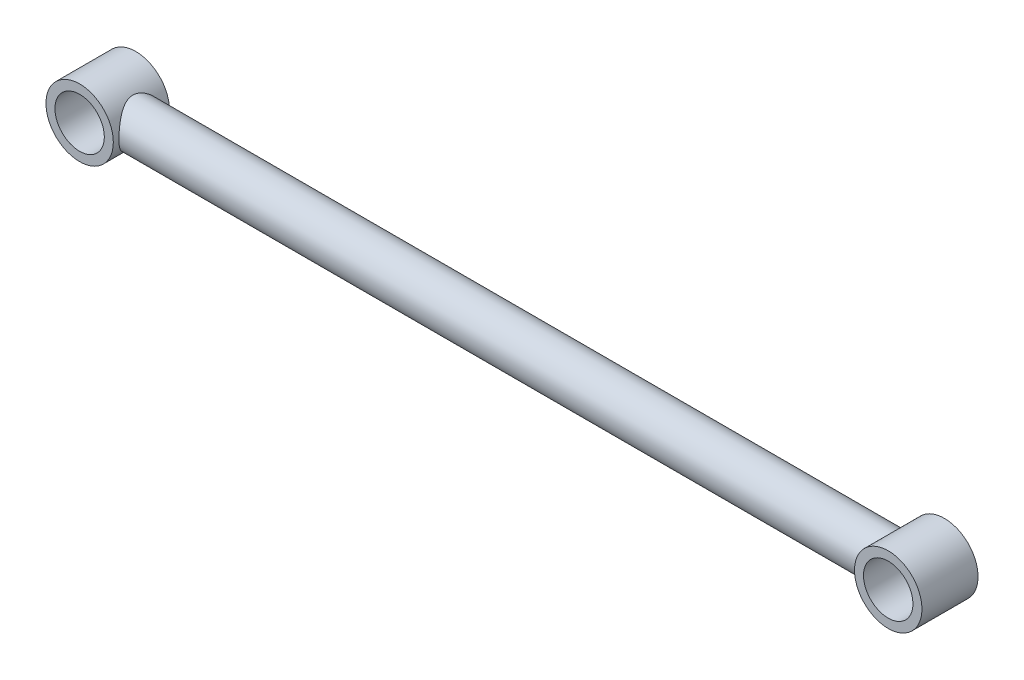
ISO-10303-21;
HEADER;
FILE_DESCRIPTION(('STEP AP214'),'2;1');
FILE_NAME('part.step','',(''),(''),'','','');
FILE_SCHEMA(('AUTOMOTIVE_DESIGN { 1 0 10303 214 1 1 1 1 }'));
ENDSEC;
DATA;
#1=APPLICATION_CONTEXT('core data for automotive mechanical design processes');
#2=APPLICATION_PROTOCOL_DEFINITION('international standard','automotive_design',2000,#1);
#3=PRODUCT_CONTEXT('',#1,'mechanical');
#4=PRODUCT('Part','Part','',(#3));
#5=PRODUCT_RELATED_PRODUCT_CATEGORY('part','',(#4));
#6=PRODUCT_DEFINITION_FORMATION('','',#4);
#7=PRODUCT_DEFINITION_CONTEXT('part definition',#1,'design');
#8=PRODUCT_DEFINITION('design','',#6,#7);
#9=PRODUCT_DEFINITION_SHAPE('','',#8);
#10=(LENGTH_UNIT() NAMED_UNIT(*) SI_UNIT(.MILLI.,.METRE.));
#11=(NAMED_UNIT(*) PLANE_ANGLE_UNIT() SI_UNIT($,.RADIAN.));
#12=(NAMED_UNIT(*) SI_UNIT($,.STERADIAN.) SOLID_ANGLE_UNIT());
#13=UNCERTAINTY_MEASURE_WITH_UNIT(LENGTH_MEASURE(1.E-05),#10,'distance_accuracy_value','');
#14=(GEOMETRIC_REPRESENTATION_CONTEXT(3) GLOBAL_UNCERTAINTY_ASSIGNED_CONTEXT((#13)) GLOBAL_UNIT_ASSIGNED_CONTEXT((#10,
#11,#12)) REPRESENTATION_CONTEXT('',''));
#15=CARTESIAN_POINT('',(0.,0.,0.));
#16=DIRECTION('',(0.,0.,1.));
#17=DIRECTION('',(1.,0.,0.));
#18=AXIS2_PLACEMENT_3D('',#15,#16,#17);
#19=CARTESIAN_POINT('',(-114.3,0.,7.9375));
#20=DIRECTION('',(0.,0.,1.));
#21=DIRECTION('',(1.,0.,0.));
#22=AXIS2_PLACEMENT_3D('',#19,#20,#21);
#23=PLANE('',#22);
#24=CARTESIAN_POINT('',(-114.3,0.,7.9375));
#25=DIRECTION('',(0.,0.,1.));
#26=DIRECTION('',(1.,0.,0.));
#27=AXIS2_PLACEMENT_3D('',#24,#25,#26);
#28=CIRCLE('',#27,9.52500000000001);
#29=CARTESIAN_POINT('',(-104.775,0.,7.9375));
#30=VERTEX_POINT('',#29);
#31=EDGE_CURVE('E10',#30,#30,#28,.T.);
#32=ORIENTED_EDGE('',*,*,#31,.T.);
#33=EDGE_LOOP('',(#32));
#34=FACE_BOUND('',#33,.T.);
#35=CARTESIAN_POINT('',(-114.3,0.,7.9375));
#36=DIRECTION('',(0.,0.,1.));
#37=DIRECTION('',(1.,0.,0.));
#38=AXIS2_PLACEMENT_3D('',#35,#36,#37);
#39=CIRCLE('',#38,6.985);
#40=CARTESIAN_POINT('',(-107.315,0.,7.9375));
#41=VERTEX_POINT('',#40);
#42=EDGE_CURVE('E50',#41,#41,#39,.T.);
#43=ORIENTED_EDGE('',*,*,#42,.F.);
#44=EDGE_LOOP('',(#43));
#45=FACE_BOUND('',#44,.T.);
#46=ADVANCED_FACE('F38',(#34,#45),#23,.T.);
#47=CARTESIAN_POINT('',(-114.3,0.,-7.9375));
#48=DIRECTION('',(0.,0.,1.));
#49=DIRECTION('',(1.,0.,0.));
#50=AXIS2_PLACEMENT_3D('',#47,#48,#49);
#51=PLANE('',#50);
#52=CARTESIAN_POINT('',(-114.3,0.,-7.9375));
#53=DIRECTION('',(0.,0.,1.));
#54=DIRECTION('',(1.,0.,0.));
#55=AXIS2_PLACEMENT_3D('',#52,#53,#54);
#56=CIRCLE('',#55,9.52500000000001);
#57=CARTESIAN_POINT('',(-104.775,0.,-7.9375));
#58=VERTEX_POINT('',#57);
#59=EDGE_CURVE('E37',#58,#58,#56,.T.);
#60=ORIENTED_EDGE('',*,*,#59,.F.);
#61=EDGE_LOOP('',(#60));
#62=FACE_BOUND('',#61,.T.);
#63=CARTESIAN_POINT('',(-114.3,0.,-7.9375));
#64=DIRECTION('',(0.,0.,1.));
#65=DIRECTION('',(1.,0.,0.));
#66=AXIS2_PLACEMENT_3D('',#63,#64,#65);
#67=CIRCLE('',#66,6.985);
#68=CARTESIAN_POINT('',(-107.315,0.,-7.9375));
#69=VERTEX_POINT('',#68);
#70=EDGE_CURVE('E47',#69,#69,#67,.T.);
#71=ORIENTED_EDGE('',*,*,#70,.T.);
#72=EDGE_LOOP('',(#71));
#73=FACE_BOUND('',#72,.T.);
#74=ADVANCED_FACE('F96',(#62,#73),#51,.F.);
#75=CARTESIAN_POINT('',(-114.3,0.,7.9375));
#76=DIRECTION('',(0.,0.,-1.));
#77=DIRECTION('',(-1.,0.,0.));
#78=AXIS2_PLACEMENT_3D('',#75,#76,#77);
#79=CYLINDRICAL_SURFACE('',#78,9.52500000000001);
#80=CARTESIAN_POINT('',(-104.775,0.,-6.35));
#81=CARTESIAN_POINT('',(-104.775000046979,0.159522184680151,-6.34999995309993));
#82=CARTESIAN_POINT('',(-104.779015986517,0.319045176051453,-6.34398077800588));
#83=CARTESIAN_POINT('',(-104.794978527502,0.636787051617951,-6.31999903690909));
#84=CARTESIAN_POINT('',(-104.80692517069,0.795005928944789,-6.30203640804456));
#85=CARTESIAN_POINT('',(-104.838460307179,1.10896054848766,-6.25443250914488));
#86=CARTESIAN_POINT('',(-104.858051779359,1.26469529808782,-6.22478668659856));
#87=CARTESIAN_POINT('',(-104.904409633166,1.57249344529696,-6.15424235588193));
#88=CARTESIAN_POINT('',(-104.93117610155,1.72455679848855,-6.11334371164659));
#89=CARTESIAN_POINT('',(-104.991134625795,2.0232991313789,-6.02105271254959));
#90=CARTESIAN_POINT('',(-105.024294057865,2.17000113120487,-5.96971356640109));
#91=CARTESIAN_POINT('',(-105.096428688631,2.45804513242559,-5.85700143837656));
#92=CARTESIAN_POINT('',(-105.135406152721,2.59938501894372,-5.79562454716315));
#93=CARTESIAN_POINT('',(-105.259913593527,3.01423554513469,-5.59738202122274));
#94=CARTESIAN_POINT('',(-105.353072441146,3.27883515147387,-5.44632353198541));
#95=CARTESIAN_POINT('',(-105.561537093138,3.80142041951417,-5.09695259312099));
#96=CARTESIAN_POINT('',(-105.67805141233,4.0569395333457,-4.8957180412682));
#97=CARTESIAN_POINT('',(-105.918578676676,4.53304949629232,-4.45853706819435));
#98=CARTESIAN_POINT('',(-106.042602212729,4.75358934716347,-4.22254091484816));
#99=CARTESIAN_POINT('',(-106.236520724273,5.07195092137751,-3.8252657100131));
#100=CARTESIAN_POINT('',(-106.307238340935,5.18236901523892,-3.6743180921881));
#101=CARTESIAN_POINT('',(-106.44576818144,5.39001471464344,-3.36235031614727));
#102=CARTESIAN_POINT('',(-106.513579743182,5.4872393250594,-3.20132788287224));
#103=CARTESIAN_POINT('',(-106.709012460451,5.7577566096913,-2.70419909809922));
#104=CARTESIAN_POINT('',(-106.82904613228,5.91054020678916,-2.35322869616773));
#105=CARTESIAN_POINT('',(-106.998261159788,6.11742154042014,-1.72484951871111));
#106=CARTESIAN_POINT('',(-107.057893093953,6.18727602427478,-1.45545976596657));
#107=CARTESIAN_POINT('',(-107.125563890268,6.26531820247608,-1.04302236510498));
#108=CARTESIAN_POINT('',(-107.144488102872,6.28687240788072,-0.904207956229357));
#109=CARTESIAN_POINT('',(-107.174415904695,6.3207759558173,-0.624583310483378));
#110=CARTESIAN_POINT('',(-107.185419450505,6.33312524790352,-0.483773062679525));
#111=CARTESIAN_POINT('',(-107.19906314611,6.34841901679302,-0.200650368697279));
#112=CARTESIAN_POINT('',(-107.201668474253,6.35132433633169,-0.0583341165071237));
#113=CARTESIAN_POINT('',(-107.198309166824,6.34756793895041,0.226068969145017));
#114=CARTESIAN_POINT('',(-107.192344502142,6.34090618953289,0.368155801826066));
#115=CARTESIAN_POINT('',(-107.172091797798,6.31813114119061,0.651046759237973));
#116=CARTESIAN_POINT('',(-107.157799247005,6.3020127196492,0.791850146722155));
#117=CARTESIAN_POINT('',(-107.12147709183,6.26060539238662,1.07111152675893));
#118=CARTESIAN_POINT('',(-107.099444230048,6.23531262562655,1.20956850610407));
#119=CARTESIAN_POINT('',(-107.025210423189,6.14887903259729,1.60786389937654));
#120=CARTESIAN_POINT('',(-106.963797982987,6.0760573598935,1.86355519237661));
#121=CARTESIAN_POINT('',(-106.822569241335,5.90137074153365,2.35914728507178));
#122=CARTESIAN_POINT('',(-106.742746885614,5.7994962389741,2.59904285676261));
#123=CARTESIAN_POINT('',(-106.554139603236,5.54590170976804,3.108382532951));
#124=CARTESIAN_POINT('',(-106.442766085441,5.38825776175065,3.37391155926158));
#125=CARTESIAN_POINT('',(-106.213531488159,5.03771235908976,3.87792594650756));
#126=CARTESIAN_POINT('',(-106.095662533807,4.84476741891087,4.11637735817127));
#127=CARTESIAN_POINT('',(-105.908104555103,4.50810755637881,4.47595327468266));
#128=CARTESIAN_POINT('',(-105.837623502565,4.37470228651639,4.60645639811851));
#129=CARTESIAN_POINT('',(-105.699343282144,4.09615348557977,4.85581618812812));
#130=CARTESIAN_POINT('',(-105.631543321566,3.95101346324308,4.97467631266899));
#131=CARTESIAN_POINT('',(-105.50037807823,3.64956085943843,5.19986397242147));
#132=CARTESIAN_POINT('',(-105.437010607565,3.4932538681889,5.30619770873185));
#133=CARTESIAN_POINT('',(-105.316348158326,3.17007087803655,5.50537494924364));
#134=CARTESIAN_POINT('',(-105.259051510077,3.0031978054296,5.59822216529964));
#135=CARTESIAN_POINT('',(-105.162613382563,2.69345636597062,5.75252854890914));
#136=CARTESIAN_POINT('',(-105.122114554482,2.55229325204632,5.81657300618918));
#137=CARTESIAN_POINT('',(-105.046866789935,2.26434990710746,5.93459496476216));
#138=CARTESIAN_POINT('',(-105.012116689131,2.11757082097555,5.9885745048681));
#139=CARTESIAN_POINT('',(-104.949108184495,1.81925046113754,6.08583803598801));
#140=CARTESIAN_POINT('',(-104.920845697984,1.66771225100849,6.12912875481975));
#141=CARTESIAN_POINT('',(-104.871415051727,1.36072699934382,6.20450638275708));
#142=CARTESIAN_POINT('',(-104.850247001113,1.20527989771778,6.23659311951361));
#143=CARTESIAN_POINT('',(-104.815431118356,0.890896472094997,6.28922202718465));
#144=CARTESIAN_POINT('',(-104.801816584345,0.731947860313394,6.30971308872808));
#145=CARTESIAN_POINT('',(-104.782589645165,0.412470575279602,6.33861907184867));
#146=CARTESIAN_POINT('',(-104.776977250453,0.251941899963072,6.34703397764633));
#147=CARTESIAN_POINT('',(-104.773897709643,-0.0693625623608653,6.35165354452134));
#148=CARTESIAN_POINT('',(-104.776430227829,-0.230138338910224,6.34785870886032));
#149=CARTESIAN_POINT('',(-104.789575352673,-0.550602615987341,6.32812028928751));
#150=CARTESIAN_POINT('',(-104.800187614471,-0.710291162626874,6.31217722388782));
#151=CARTESIAN_POINT('',(-104.828197226723,-1.01610484215325,6.26994038091227));
#152=CARTESIAN_POINT('',(-104.845062925682,-1.1623919007298,6.24445641716826));
#153=CARTESIAN_POINT('',(-104.885191426505,-1.4520294867599,6.18352816653401));
#154=CARTESIAN_POINT('',(-104.908456400489,-1.59537899933077,6.14808049754927));
#155=CARTESIAN_POINT('',(-104.960910310942,-1.87821807256356,6.06765212024478));
#156=CARTESIAN_POINT('',(-104.990097475877,-2.01770877338369,6.02267426255711));
#157=CARTESIAN_POINT('',(-105.053845477458,-2.29219225922946,5.92365375533574));
#158=CARTESIAN_POINT('',(-105.088408378516,-2.42718329198913,5.86960762273506));
#159=CARTESIAN_POINT('',(-105.203710599838,-2.84040335082915,5.68758288364751));
#160=CARTESIAN_POINT('',(-105.292837429105,-3.10985671270755,5.54455672594065));
#161=CARTESIAN_POINT('',(-105.486150284111,-3.62171230160445,5.22465767898185));
#162=CARTESIAN_POINT('',(-105.590345600392,-3.86409767513917,5.04776388653557));
#163=CARTESIAN_POINT('',(-105.824185539793,-4.35561770830212,4.63358452856244));
#164=CARTESIAN_POINT('',(-105.955249040271,-4.59975869240833,4.3911724539023));
#165=CARTESIAN_POINT('',(-106.217385749945,-5.04618201875886,3.86993085248224));
#166=CARTESIAN_POINT('',(-106.348458903714,-5.24843542955316,3.59107637060042));
#167=CARTESIAN_POINT('',(-106.529729875084,-5.50986238821868,3.1605267462145));
#168=CARTESIAN_POINT('',(-106.585258233999,-5.58717130076448,3.02182669552111));
#169=CARTESIAN_POINT('',(-106.692076778903,-5.7317702439199,2.73764917534889));
#170=CARTESIAN_POINT('',(-106.743366461208,-5.79905908459569,2.59217090361127));
#171=CARTESIAN_POINT('',(-106.840055954372,-5.92292443514784,2.29506782648151));
#172=CARTESIAN_POINT('',(-106.885463486072,-5.97951503318805,2.14345142837806));
#173=CARTESIAN_POINT('',(-106.968794514328,-6.08139674336706,1.83453891209853));
#174=CARTESIAN_POINT('',(-107.006722749788,-6.12669501519679,1.67724646551724));
#175=CARTESIAN_POINT('',(-107.06749984168,-6.19825433375949,1.38649198607604));
#176=CARTESIAN_POINT('',(-107.091833395441,-6.22647305217836,1.25382053027027));
#177=CARTESIAN_POINT('',(-107.133570804051,-6.27446673556615,0.985934910577462));
#178=CARTESIAN_POINT('',(-107.150978120094,-6.29424591831616,0.850722052153063));
#179=CARTESIAN_POINT('',(-107.178227277172,-6.32506156675046,0.578640956196189));
#180=CARTESIAN_POINT('',(-107.188074658184,-6.33610443465317,0.441774005648219));
#181=CARTESIAN_POINT('',(-107.199837931634,-6.3492836735303,0.167265028180356));
#182=CARTESIAN_POINT('',(-107.20175370832,-6.35141991452216,0.0296229899782549));
#183=CARTESIAN_POINT('',(-107.197574216774,-6.34674580421029,-0.245464103467704));
#184=CARTESIAN_POINT('',(-107.191474375349,-6.33993034564554,-0.382909001434104));
#185=CARTESIAN_POINT('',(-107.171501290415,-6.31746425650634,-0.656495580724789));
#186=CARTESIAN_POINT('',(-107.157628110631,-6.30181369836103,-0.792637272723304));
#187=CARTESIAN_POINT('',(-107.122621591036,-6.26191390883439,-1.06282725973877));
#188=CARTESIAN_POINT('',(-107.101481599347,-6.2376567985492,-1.19687351869459));
#189=CARTESIAN_POINT('',(-107.052674684227,-6.1808817355169,-1.46205496703154));
#190=CARTESIAN_POINT('',(-107.025004029857,-6.14835905986933,-1.59318844532559));
#191=CARTESIAN_POINT('',(-106.955883081872,-6.06573926582911,-1.88633430109405));
#192=CARTESIAN_POINT('',(-106.912725362399,-6.01326849348085,-2.04727813795023));
#193=CARTESIAN_POINT('',(-106.819187712031,-5.89649603714919,-2.36265483684913));
#194=CARTESIAN_POINT('',(-106.768805178772,-5.83219008778184,-2.51708532674588));
#195=CARTESIAN_POINT('',(-106.662584339,-5.69238174900435,-2.81904098293776));
#196=CARTESIAN_POINT('',(-106.606740450649,-5.61686786273134,-2.96655885152953));
#197=CARTESIAN_POINT('',(-106.491351305536,-5.45531985241587,-3.25410503576367));
#198=CARTESIAN_POINT('',(-106.431806244331,-5.36928628396466,-3.39413374638082));
#199=CARTESIAN_POINT('',(-106.247718493342,-5.09272098351103,-3.80761264279187));
#200=CARTESIAN_POINT('',(-106.119686406323,-4.88619115977566,-4.06915988176159));
#201=CARTESIAN_POINT('',(-105.929643712746,-4.54748880942232,-4.4351460916493));
#202=CARTESIAN_POINT('',(-105.866601553467,-4.42970861704311,-4.55280093986815));
#203=CARTESIAN_POINT('',(-105.742373756995,-4.1846735424734,-4.77899524335369));
#204=CARTESIAN_POINT('',(-105.68118839912,-4.05741724464055,-4.88753333148622));
#205=CARTESIAN_POINT('',(-105.553350474575,-3.77480441041197,-5.10981077190067));
#206=CARTESIAN_POINT('',(-105.487180782639,-3.61804122148952,-5.22204543088476));
#207=CARTESIAN_POINT('',(-105.36075818322,-3.29331385940597,-5.43267985711556));
#208=CARTESIAN_POINT('',(-105.300502714498,-3.12535458825482,-5.53108562120357));
#209=CARTESIAN_POINT('',(-105.187665087446,-2.77922282777147,-5.71284454475406));
#210=CARTESIAN_POINT('',(-105.135075714858,-2.60106016331172,-5.79621187406739));
#211=CARTESIAN_POINT('',(-105.039157625632,-2.23563530318453,-5.94671693384528));
#212=CARTESIAN_POINT('',(-104.995825657525,-2.04837633086142,-6.01386036370385));
#213=CARTESIAN_POINT('',(-104.928318856579,-1.70885385876079,-6.11771744199751));
#214=CARTESIAN_POINT('',(-104.90202672284,-1.55805597368063,-6.15787747779189));
#215=CARTESIAN_POINT('',(-104.856503425899,-1.25290717991565,-6.22713306538461));
#216=CARTESIAN_POINT('',(-104.837270803833,-1.09855701233209,-6.25623090325519));
#217=CARTESIAN_POINT('',(-104.806321727847,-0.787474777626713,-6.30294439209638));
#218=CARTESIAN_POINT('',(-104.794600810707,-0.630744181662892,-6.32056686147179));
#219=CARTESIAN_POINT('',(-104.77893977759,-0.316009352639673,-6.34409490839796));
#220=CARTESIAN_POINT('',(-104.774999953468,-0.158005072029974,-6.35000004645403));
#221=CARTESIAN_POINT('',(-104.775,0.,-6.35));
#222=B_SPLINE_CURVE_WITH_KNOTS('',3,(#80,#81,#82,#83,#84,#85,#86,#87,#88,#89,#90,#91,#92,#93,
#94,#95,#96,#97,#98,#99,#100,#101,#102,#103,#104,#105,#106,#107,#108,#109,#110,#111,#112,#113,
#114,#115,#116,#117,#118,#119,#120,#121,#122,#123,#124,#125,#126,#127,#128,#129,#130,#131,#132,
#133,#134,#135,#136,#137,#138,#139,#140,#141,#142,#143,#144,#145,#146,#147,#148,#149,#150,#151,
#152,#153,#154,#155,#156,#157,#158,#159,#160,#161,#162,#163,#164,#165,#166,#167,#168,#169,#170,
#171,#172,#173,#174,#175,#176,#177,#178,#179,#180,#181,#182,#183,#184,#185,#186,#187,#188,#189,
#190,#191,#192,#193,#194,#195,#196,#197,#198,#199,#200,#201,#202,#203,#204,#205,#206,#207,#208,
#209,#210,#211,#212,#213,#214,#215,#216,#217,#218,#219,#220,#221),.UNSPECIFIED.,.T.,.F.,(4,2,2,
2,2,2,2,2,2,2,2,2,2,2,2,2,2,2,2,2,2,2,2,2,2,2,2,2,2,2,2,2,2,2,2,2,2,2,2,2,2,2,2,2,2,2,2,2,2,2,2,
2,2,2,2,2,2,2,2,2,2,2,2,2,2,2,2,2,2,2,4),(0.,0.478405380617943,0.956813279239058,
1.4354077804509,1.91400806890838,2.3902277496366,2.8666333442711,3.81862625068164,
4.85140247863724,5.88567087629457,6.48485332921756,7.08417157918499,8.27951533243023,
9.12972915875147,9.55449841242715,9.97926999395054,10.4058005617563,10.8323325784107,
11.2590958582371,11.6860389509021,12.5013302126937,13.3168899738091,14.2983393334806,
15.2810059330147,15.8788611327681,16.47653822789,17.0739181926961,17.6711334295996,
18.1513005477461,18.631370294298,19.1111370979203,19.5909112813935,20.0727839793195,
20.5546573068919,21.0365107728437,21.5183436734241,21.9661749409648,22.414158404953,
22.8620080586,23.3100301238975,24.2594691600945,25.2094960927676,26.3097517407434,
27.4107648115877,27.9150410851497,28.4193771963738,28.9230444657226,29.4263915772579,
29.8393858100912,30.2521734005924,30.6646582077438,31.077149034642,31.4898753043958,
31.9025981907155,32.315699884932,32.729038156064,33.2523652916646,33.7758814044032,
34.299938288488,34.8239675067414,35.8903398922337,36.4240224132793,36.9577848221177,
37.5684710444785,38.1788916227339,38.7887339977983,39.3983618250758,39.8725796504945,
40.3466994225,40.8205372255695,41.2943928010534),.UNSPECIFIED.);
#223=CARTESIAN_POINT('',(-104.775,0.,-6.35));
#224=VERTEX_POINT('',#223);
#225=EDGE_CURVE('E55',#224,#224,#222,.T.);
#226=ORIENTED_EDGE('',*,*,#225,.F.);
#227=EDGE_LOOP('',(#226));
#228=FACE_BOUND('',#227,.T.);
#229=ORIENTED_EDGE('',*,*,#31,.F.);
#230=EDGE_LOOP('',(#229));
#231=FACE_BOUND('',#230,.T.);
#232=ORIENTED_EDGE('',*,*,#59,.T.);
#233=EDGE_LOOP('',(#232));
#234=FACE_BOUND('',#233,.T.);
#235=ADVANCED_FACE('F36',(#228,#231,#234),#79,.T.);
#236=CARTESIAN_POINT('',(-114.3,0.,7.9375));
#237=DIRECTION('',(0.,0.,-1.));
#238=DIRECTION('',(-1.,0.,0.));
#239=AXIS2_PLACEMENT_3D('',#236,#237,#238);
#240=CYLINDRICAL_SURFACE('',#239,6.985);
#241=ORIENTED_EDGE('',*,*,#42,.T.);
#242=EDGE_LOOP('',(#241));
#243=FACE_BOUND('',#242,.T.);
#244=ORIENTED_EDGE('',*,*,#70,.F.);
#245=EDGE_LOOP('',(#244));
#246=FACE_BOUND('',#245,.T.);
#247=ADVANCED_FACE('F103',(#243,#246),#240,.F.);
#248=CARTESIAN_POINT('',(-123.826,0.,0.));
#249=DIRECTION('',(1.,0.,0.));
#250=DIRECTION('',(0.,0.,-1.));
#251=AXIS2_PLACEMENT_3D('',#248,#249,#250);
#252=CYLINDRICAL_SURFACE('',#251,6.35);
#253=ORIENTED_EDGE('',*,*,#225,.T.);
#254=EDGE_LOOP('',(#253));
#255=FACE_BOUND('',#254,.T.);
#256=CARTESIAN_POINT('',(104.775,0.,6.35));
#257=CARTESIAN_POINT('',(104.775000046979,-0.15952218468015,6.34999995309993));
#258=CARTESIAN_POINT('',(104.779015986517,-0.319045176051452,6.34398077800588));
#259=CARTESIAN_POINT('',(104.794978527502,-0.636787051617951,6.31999903690909));
#260=CARTESIAN_POINT('',(104.80692517069,-0.795005928944788,6.30203640804456));
#261=CARTESIAN_POINT('',(104.838460307179,-1.10896054848766,6.25443250914488));
#262=CARTESIAN_POINT('',(104.858051779359,-1.26469529808782,6.22478668659856));
#263=CARTESIAN_POINT('',(104.904409633166,-1.57249344529696,6.15424235588193));
#264=CARTESIAN_POINT('',(104.93117610155,-1.72455679848855,6.11334371164659));
#265=CARTESIAN_POINT('',(104.991134625795,-2.0232991313789,6.02105271254959));
#266=CARTESIAN_POINT('',(105.024294057865,-2.17000113120487,5.96971356640109));
#267=CARTESIAN_POINT('',(105.096428688631,-2.45804513242559,5.85700143837656));
#268=CARTESIAN_POINT('',(105.135406152721,-2.59938501894372,5.79562454716315));
#269=CARTESIAN_POINT('',(105.259913593527,-3.01423554513468,5.59738202122274));
#270=CARTESIAN_POINT('',(105.353072441146,-3.27883515147386,5.44632353198541));
#271=CARTESIAN_POINT('',(105.561537093138,-3.80142041951416,5.09695259312099));
#272=CARTESIAN_POINT('',(105.67805141233,-4.05693953334569,4.89571804126821));
#273=CARTESIAN_POINT('',(105.918578676676,-4.53304949629232,4.45853706819436));
#274=CARTESIAN_POINT('',(106.042602212729,-4.75358934716347,4.22254091484816));
#275=CARTESIAN_POINT('',(106.236520724273,-5.0719509213775,3.8252657100131));
#276=CARTESIAN_POINT('',(106.307238340935,-5.18236901523892,3.6743180921881));
#277=CARTESIAN_POINT('',(106.44576818144,-5.39001471464344,3.36235031614727));
#278=CARTESIAN_POINT('',(106.513579743182,-5.4872393250594,3.20132788287224));
#279=CARTESIAN_POINT('',(106.709012460451,-5.7577566096913,2.70419909809922));
#280=CARTESIAN_POINT('',(106.82904613228,-5.91054020678915,2.35322869616773));
#281=CARTESIAN_POINT('',(106.998261159788,-6.11742154042014,1.72484951871112));
#282=CARTESIAN_POINT('',(107.057893093953,-6.18727602427478,1.45545976596658));
#283=CARTESIAN_POINT('',(107.125563890268,-6.26531820247608,1.04302236510499));
#284=CARTESIAN_POINT('',(107.144488102872,-6.28687240788072,0.904207956229366));
#285=CARTESIAN_POINT('',(107.174415904695,-6.3207759558173,0.624583310483388));
#286=CARTESIAN_POINT('',(107.185419450505,-6.33312524790352,0.483773062679535));
#287=CARTESIAN_POINT('',(107.19906314611,-6.34841901679302,0.20065036869729));
#288=CARTESIAN_POINT('',(107.201668474253,-6.35132433633169,0.0583341165071354));
#289=CARTESIAN_POINT('',(107.198309166824,-6.34756793895041,-0.226068969145005));
#290=CARTESIAN_POINT('',(107.192344502142,-6.34090618953289,-0.368155801826053));
#291=CARTESIAN_POINT('',(107.172091797798,-6.31813114119061,-0.65104675923796));
#292=CARTESIAN_POINT('',(107.157799247005,-6.30201271964921,-0.791850146722139));
#293=CARTESIAN_POINT('',(107.12147709183,-6.26060539238662,-1.07111152675892));
#294=CARTESIAN_POINT('',(107.099444230048,-6.23531262562655,-1.20956850610406));
#295=CARTESIAN_POINT('',(107.025210423189,-6.14887903259729,-1.60786389937653));
#296=CARTESIAN_POINT('',(106.963797982987,-6.0760573598935,-1.86355519237659));
#297=CARTESIAN_POINT('',(106.822569241335,-5.90137074153366,-2.35914728507176));
#298=CARTESIAN_POINT('',(106.742746885614,-5.7994962389741,-2.59904285676259));
#299=CARTESIAN_POINT('',(106.554139603236,-5.54590170976805,-3.10838253295099));
#300=CARTESIAN_POINT('',(106.442766085441,-5.38825776175066,-3.37391155926156));
#301=CARTESIAN_POINT('',(106.213531488159,-5.03771235908977,-3.87792594650754));
#302=CARTESIAN_POINT('',(106.095662533807,-4.84476741891088,-4.11637735817125));
#303=CARTESIAN_POINT('',(105.908104555103,-4.50810755637883,-4.47595327468265));
#304=CARTESIAN_POINT('',(105.837623502565,-4.37470228651641,-4.60645639811849));
#305=CARTESIAN_POINT('',(105.699343282144,-4.09615348557979,-4.8558161881281));
#306=CARTESIAN_POINT('',(105.631543321566,-3.9510134632431,-4.97467631266897));
#307=CARTESIAN_POINT('',(105.50037807823,-3.64956085943845,-5.19986397242146));
#308=CARTESIAN_POINT('',(105.437010607565,-3.49325386818892,-5.30619770873183));
#309=CARTESIAN_POINT('',(105.316348158326,-3.17007087803658,-5.50537494924363));
#310=CARTESIAN_POINT('',(105.259051510077,-3.00319780542963,-5.59822216529963));
#311=CARTESIAN_POINT('',(105.162613382563,-2.69345636597065,-5.75252854890913));
#312=CARTESIAN_POINT('',(105.122114554482,-2.55229325204636,-5.81657300618916));
#313=CARTESIAN_POINT('',(105.046866789935,-2.26434990710749,-5.93459496476215));
#314=CARTESIAN_POINT('',(105.012116689131,-2.11757082097558,-5.98857450486809));
#315=CARTESIAN_POINT('',(104.949108184495,-1.81925046113757,-6.08583803598801));
#316=CARTESIAN_POINT('',(104.920845697984,-1.66771225100852,-6.12912875481975));
#317=CARTESIAN_POINT('',(104.871415051727,-1.36072699934386,-6.20450638275708));
#318=CARTESIAN_POINT('',(104.850247001113,-1.20527989771781,-6.2365931195136));
#319=CARTESIAN_POINT('',(104.815431118356,-0.890896472095028,-6.28922202718465));
#320=CARTESIAN_POINT('',(104.801816584345,-0.731947860313424,-6.30971308872807));
#321=CARTESIAN_POINT('',(104.782589645165,-0.412470575279631,-6.33861907184867));
#322=CARTESIAN_POINT('',(104.776977250453,-0.251941899963101,-6.34703397764633));
#323=CARTESIAN_POINT('',(104.773897709643,0.0693625623608371,-6.35165354452134));
#324=CARTESIAN_POINT('',(104.776430227829,0.230138338910197,-6.34785870886032));
#325=CARTESIAN_POINT('',(104.789575352673,0.550602615987315,-6.32812028928751));
#326=CARTESIAN_POINT('',(104.800187614471,0.710291162626848,-6.31217722388782));
#327=CARTESIAN_POINT('',(104.828197226723,1.01610484215323,-6.26994038091227));
#328=CARTESIAN_POINT('',(104.845062925682,1.16239190072977,-6.24445641716827));
#329=CARTESIAN_POINT('',(104.885191426505,1.45202948675987,-6.18352816653401));
#330=CARTESIAN_POINT('',(104.908456400489,1.59537899933075,-6.14808049754928));
#331=CARTESIAN_POINT('',(104.960910310942,1.87821807256354,-6.06765212024479));
#332=CARTESIAN_POINT('',(104.990097475877,2.01770877338366,-6.02267426255711));
#333=CARTESIAN_POINT('',(105.053845477458,2.29219225922943,-5.92365375533575));
#334=CARTESIAN_POINT('',(105.088408378516,2.4271832919891,-5.86960762273507));
#335=CARTESIAN_POINT('',(105.203710599838,2.84040335082912,-5.68758288364752));
#336=CARTESIAN_POINT('',(105.292837429105,3.10985671270752,-5.54455672594066));
#337=CARTESIAN_POINT('',(105.486150284111,3.62171230160442,-5.22465767898187));
#338=CARTESIAN_POINT('',(105.590345600392,3.86409767513915,-5.04776388653559));
#339=CARTESIAN_POINT('',(105.824185539793,4.3556177083021,-4.63358452856246));
#340=CARTESIAN_POINT('',(105.955249040271,4.59975869240831,-4.39117245390232));
#341=CARTESIAN_POINT('',(106.217385749945,5.04618201875884,-3.86993085248227));
#342=CARTESIAN_POINT('',(106.348458903714,5.24843542955314,-3.59107637060044));
#343=CARTESIAN_POINT('',(106.529729875084,5.50986238821866,-3.16052674621453));
#344=CARTESIAN_POINT('',(106.585258233999,5.58717130076447,-3.02182669552114));
#345=CARTESIAN_POINT('',(106.692076778903,5.73177024391989,-2.73764917534892));
#346=CARTESIAN_POINT('',(106.743366461208,5.79905908459568,-2.5921709036113));
#347=CARTESIAN_POINT('',(106.840055954372,5.92292443514782,-2.29506782648154));
#348=CARTESIAN_POINT('',(106.885463486072,5.97951503318804,-2.1434514283781));
#349=CARTESIAN_POINT('',(106.968794514328,6.08139674336705,-1.83453891209857));
#350=CARTESIAN_POINT('',(107.006722749788,6.12669501519678,-1.67724646551727));
#351=CARTESIAN_POINT('',(107.06749984168,6.19825433375948,-1.38649198607607));
#352=CARTESIAN_POINT('',(107.091833395442,6.22647305217835,-1.2538205302703));
#353=CARTESIAN_POINT('',(107.133570804051,6.27446673556615,-0.985934910577492));
#354=CARTESIAN_POINT('',(107.150978120094,6.29424591831616,-0.850722052153092));
#355=CARTESIAN_POINT('',(107.178227277172,6.32506156675046,-0.578640956196219));
#356=CARTESIAN_POINT('',(107.188074658184,6.33610443465317,-0.441774005648248));
#357=CARTESIAN_POINT('',(107.199837931635,6.3492836735303,-0.167265028180387));
#358=CARTESIAN_POINT('',(107.20175370832,6.35141991452216,-0.0296229899782865));
#359=CARTESIAN_POINT('',(107.197574216774,6.34674580421029,0.245464103467673));
#360=CARTESIAN_POINT('',(107.191474375349,6.33993034564554,0.382909001434074));
#361=CARTESIAN_POINT('',(107.171501290415,6.31746425650635,0.656495580724758));
#362=CARTESIAN_POINT('',(107.157628110631,6.30181369836104,0.792637272723271));
#363=CARTESIAN_POINT('',(107.122621591036,6.2619139088344,1.06282725973874));
#364=CARTESIAN_POINT('',(107.101481599347,6.23765679854921,1.19687351869456));
#365=CARTESIAN_POINT('',(107.052674684227,6.18088173551691,1.46205496703151));
#366=CARTESIAN_POINT('',(107.025004029857,6.14835905986934,1.59318844532556));
#367=CARTESIAN_POINT('',(106.955883081872,6.06573926582912,1.88633430109402));
#368=CARTESIAN_POINT('',(106.912725362399,6.01326849348086,2.0472781379502));
#369=CARTESIAN_POINT('',(106.819187712031,5.8964960371492,2.3626548368491));
#370=CARTESIAN_POINT('',(106.768805178772,5.83219008778186,2.51708532674585));
#371=CARTESIAN_POINT('',(106.662584339,5.69238174900437,2.81904098293772));
#372=CARTESIAN_POINT('',(106.606740450649,5.61686786273136,2.96655885152949));
#373=CARTESIAN_POINT('',(106.491351305536,5.4553198524159,3.25410503576363));
#374=CARTESIAN_POINT('',(106.431806244331,5.36928628396468,3.39413374638078));
#375=CARTESIAN_POINT('',(106.247718493342,5.09272098351106,3.80761264279183));
#376=CARTESIAN_POINT('',(106.119686406323,4.8861911597757,4.06915988176155));
#377=CARTESIAN_POINT('',(105.929643712746,4.54748880942235,4.43514609164926));
#378=CARTESIAN_POINT('',(105.866601553467,4.42970861704314,4.55280093986813));
#379=CARTESIAN_POINT('',(105.742373756995,4.18467354247343,4.77899524335366));
#380=CARTESIAN_POINT('',(105.68118839912,4.05741724464059,4.88753333148619));
#381=CARTESIAN_POINT('',(105.553350474575,3.77480441041201,5.10981077190064));
#382=CARTESIAN_POINT('',(105.487180782639,3.61804122148956,5.22204543088473));
#383=CARTESIAN_POINT('',(105.36075818322,3.29331385940601,5.43267985711553));
#384=CARTESIAN_POINT('',(105.300502714498,3.12535458825485,5.53108562120355));
#385=CARTESIAN_POINT('',(105.187665087446,2.7792228277715,5.71284454475405));
#386=CARTESIAN_POINT('',(105.135075714858,2.60106016331175,5.79621187406737));
#387=CARTESIAN_POINT('',(105.039157625632,2.23563530318457,5.94671693384527));
#388=CARTESIAN_POINT('',(104.995825657525,2.04837633086146,6.01386036370384));
#389=CARTESIAN_POINT('',(104.928318856579,1.70885385876083,6.1177174419975));
#390=CARTESIAN_POINT('',(104.90202672284,1.55805597368067,6.15787747779188));
#391=CARTESIAN_POINT('',(104.856503425899,1.25290717991569,6.22713306538461));
#392=CARTESIAN_POINT('',(104.837270803833,1.09855701233212,6.25623090325518));
#393=CARTESIAN_POINT('',(104.806321727847,0.787474777626733,6.30294439209638));
#394=CARTESIAN_POINT('',(104.794600810707,0.630744181662909,6.32056686147178));
#395=CARTESIAN_POINT('',(104.77893977759,0.316009352639683,6.34409490839796));
#396=CARTESIAN_POINT('',(104.774999953468,0.158005072029979,6.35000004645403));
#397=CARTESIAN_POINT('',(104.775,0.,6.35));
#398=B_SPLINE_CURVE_WITH_KNOTS('',3,(#256,#257,#258,#259,#260,#261,#262,#263,#264,#265,#266,
#267,#268,#269,#270,#271,#272,#273,#274,#275,#276,#277,#278,#279,#280,#281,#282,#283,#284,#285,
#286,#287,#288,#289,#290,#291,#292,#293,#294,#295,#296,#297,#298,#299,#300,#301,#302,#303,#304,
#305,#306,#307,#308,#309,#310,#311,#312,#313,#314,#315,#316,#317,#318,#319,#320,#321,#322,#323,
#324,#325,#326,#327,#328,#329,#330,#331,#332,#333,#334,#335,#336,#337,#338,#339,#340,#341,#342,
#343,#344,#345,#346,#347,#348,#349,#350,#351,#352,#353,#354,#355,#356,#357,#358,#359,#360,#361,
#362,#363,#364,#365,#366,#367,#368,#369,#370,#371,#372,#373,#374,#375,#376,#377,#378,#379,#380,
#381,#382,#383,#384,#385,#386,#387,#388,#389,#390,#391,#392,#393,#394,#395,#396,#397),
.UNSPECIFIED.,.T.,.F.,(4,2,2,2,2,2,2,2,2,2,2,2,2,2,2,2,2,2,2,2,2,2,2,2,2,2,2,2,2,2,2,2,2,2,2,2,
2,2,2,2,2,2,2,2,2,2,2,2,2,2,2,2,2,2,2,2,2,2,2,2,2,2,2,2,2,2,2,2,2,2,4),(0.,0.478405380617942,
0.956813279239057,1.4354077804509,1.91400806890838,2.39022774963661,2.8666333442711,
3.81862625068164,4.85140247863723,5.88567087629457,6.48485332921756,7.08417157918499,
8.27951533243023,9.12972915875147,9.55449841242714,9.97926999395053,10.4058005617562,
10.8323325784106,11.259095858237,11.6860389509021,12.5013302126937,13.3168899738091,
14.2983393334806,15.2810059330147,15.8788611327681,16.47653822789,17.0739181926961,
17.6711334295996,18.1513005477461,18.631370294298,19.1111370979202,19.5909112813935,
20.0727839793195,20.5546573068919,21.0365107728437,21.5183436734241,21.9661749409648,
22.414158404953,22.8620080586,23.3100301238974,24.2594691600945,25.2094960927676,
26.3097517407434,27.4107648115877,27.9150410851497,28.4193771963737,28.9230444657226,
29.4263915772579,29.8393858100912,30.2521734005924,30.6646582077437,31.077149034642,
31.4898753043958,31.9025981907155,32.3156998849319,32.7290381560639,33.2523652916646,
33.7758814044031,34.299938288488,34.8239675067413,35.8903398922337,36.4240224132793,
36.9577848221176,37.5684710444784,38.1788916227338,38.7887339977983,39.3983618250758,
39.8725796504945,40.3466994224999,40.8205372255695,41.2943928010534),.UNSPECIFIED.);
#399=CARTESIAN_POINT('',(104.775,0.,6.35));
#400=VERTEX_POINT('',#399);
#401=EDGE_CURVE('E64',#400,#400,#398,.T.);
#402=ORIENTED_EDGE('',*,*,#401,.F.);
#403=EDGE_LOOP('',(#402));
#404=FACE_BOUND('',#403,.T.);
#405=ADVANCED_FACE('F66',(#255,#404),#252,.T.);
#406=CARTESIAN_POINT('',(114.3,0.,7.9375));
#407=DIRECTION('',(0.,0.,-1.));
#408=DIRECTION('',(-1.,0.,0.));
#409=AXIS2_PLACEMENT_3D('',#406,#407,#408);
#410=PLANE('',#409);
#411=CARTESIAN_POINT('',(114.3,0.,7.9375));
#412=DIRECTION('',(0.,0.,1.));
#413=DIRECTION('',(-1.,0.,0.));
#414=AXIS2_PLACEMENT_3D('',#411,#412,#413);
#415=CIRCLE('',#414,9.52499999999999);
#416=CARTESIAN_POINT('',(104.775,0.,7.9375));
#417=VERTEX_POINT('',#416);
#418=EDGE_CURVE('E132',#417,#417,#415,.T.);
#419=ORIENTED_EDGE('',*,*,#418,.T.);
#420=EDGE_LOOP('',(#419));
#421=FACE_BOUND('',#420,.T.);
#422=CARTESIAN_POINT('',(114.3,0.,7.9375));
#423=DIRECTION('',(0.,0.,1.));
#424=DIRECTION('',(-1.,0.,0.));
#425=AXIS2_PLACEMENT_3D('',#422,#423,#424);
#426=CIRCLE('',#425,6.98499999999998);
#427=CARTESIAN_POINT('',(107.315,0.,7.9375));
#428=VERTEX_POINT('',#427);
#429=EDGE_CURVE('E127',#428,#428,#426,.T.);
#430=ORIENTED_EDGE('',*,*,#429,.F.);
#431=EDGE_LOOP('',(#430));
#432=FACE_BOUND('',#431,.T.);
#433=ADVANCED_FACE('F82',(#421,#432),#410,.F.);
#434=CARTESIAN_POINT('',(114.3,0.,-7.9375));
#435=DIRECTION('',(0.,0.,-1.));
#436=DIRECTION('',(-1.,0.,0.));
#437=AXIS2_PLACEMENT_3D('',#434,#435,#436);
#438=PLANE('',#437);
#439=CARTESIAN_POINT('',(114.3,0.,-7.9375));
#440=DIRECTION('',(0.,0.,1.));
#441=DIRECTION('',(-1.,0.,0.));
#442=AXIS2_PLACEMENT_3D('',#439,#440,#441);
#443=CIRCLE('',#442,9.52499999999999);
#444=CARTESIAN_POINT('',(104.775,0.,-7.9375));
#445=VERTEX_POINT('',#444);
#446=EDGE_CURVE('E133',#445,#445,#443,.T.);
#447=ORIENTED_EDGE('',*,*,#446,.F.);
#448=EDGE_LOOP('',(#447));
#449=FACE_BOUND('',#448,.T.);
#450=CARTESIAN_POINT('',(114.3,0.,-7.9375));
#451=DIRECTION('',(0.,0.,1.));
#452=DIRECTION('',(-1.,0.,0.));
#453=AXIS2_PLACEMENT_3D('',#450,#451,#452);
#454=CIRCLE('',#453,6.98499999999998);
#455=CARTESIAN_POINT('',(107.315,0.,-7.9375));
#456=VERTEX_POINT('',#455);
#457=EDGE_CURVE('E121',#456,#456,#454,.T.);
#458=ORIENTED_EDGE('',*,*,#457,.T.);
#459=EDGE_LOOP('',(#458));
#460=FACE_BOUND('',#459,.T.);
#461=ADVANCED_FACE('F81',(#449,#460),#438,.T.);
#462=CARTESIAN_POINT('',(114.3,0.,7.9375));
#463=DIRECTION('',(0.,0.,-1.));
#464=DIRECTION('',(-1.,0.,0.));
#465=AXIS2_PLACEMENT_3D('',#462,#463,#464);
#466=CYLINDRICAL_SURFACE('',#465,9.52499999999999);
#467=ORIENTED_EDGE('',*,*,#401,.T.);
#468=EDGE_LOOP('',(#467));
#469=FACE_BOUND('',#468,.T.);
#470=ORIENTED_EDGE('',*,*,#418,.F.);
#471=EDGE_LOOP('',(#470));
#472=FACE_BOUND('',#471,.T.);
#473=ORIENTED_EDGE('',*,*,#446,.T.);
#474=EDGE_LOOP('',(#473));
#475=FACE_BOUND('',#474,.T.);
#476=ADVANCED_FACE('F80',(#469,#472,#475),#466,.T.);
#477=CARTESIAN_POINT('',(114.3,0.,7.9375));
#478=DIRECTION('',(0.,0.,-1.));
#479=DIRECTION('',(-1.,0.,0.));
#480=AXIS2_PLACEMENT_3D('',#477,#478,#479);
#481=CYLINDRICAL_SURFACE('',#480,6.98499999999998);
#482=ORIENTED_EDGE('',*,*,#429,.T.);
#483=EDGE_LOOP('',(#482));
#484=FACE_BOUND('',#483,.T.);
#485=ORIENTED_EDGE('',*,*,#457,.F.);
#486=EDGE_LOOP('',(#485));
#487=FACE_BOUND('',#486,.T.);
#488=ADVANCED_FACE('F78',(#484,#487),#481,.F.);
#489=CLOSED_SHELL('',(#46,#74,#235,#247,#405,#433,#461,#476,#488));
#490=MANIFOLD_SOLID_BREP('B2',#489);
#491=ADVANCED_BREP_SHAPE_REPRESENTATION('',(#18,#490),#14);
#492=SHAPE_DEFINITION_REPRESENTATION(#9,#491);
ENDSEC;
END-ISO-10303-21;
